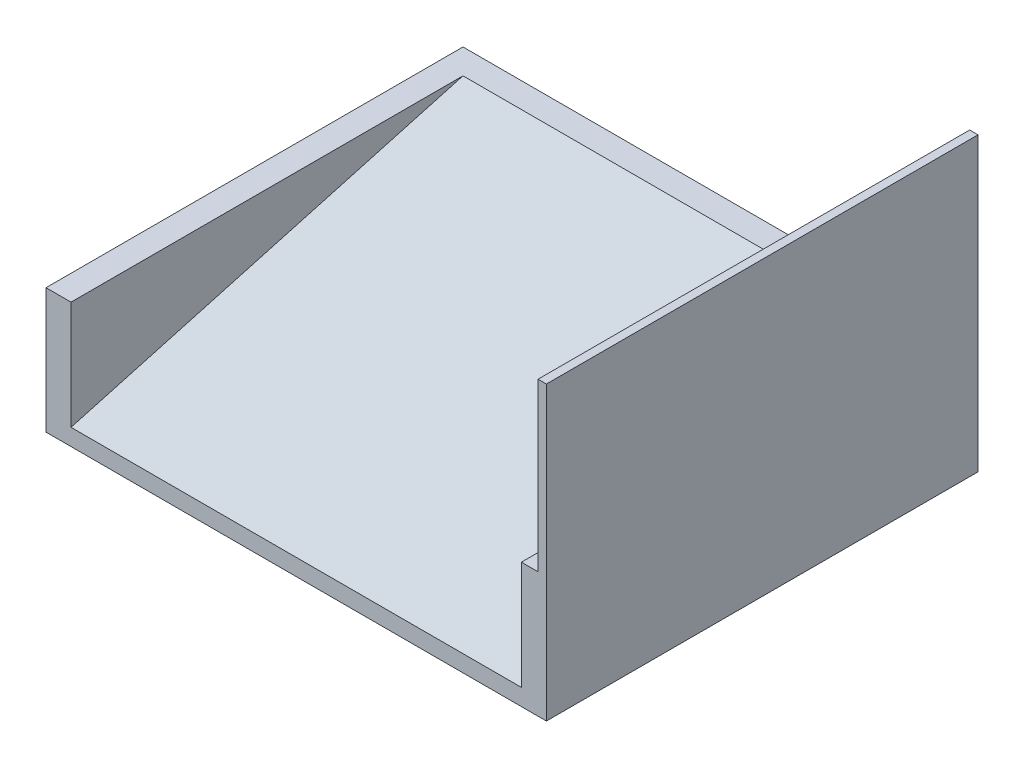
ISO-10303-21;
HEADER;
FILE_DESCRIPTION(('STEP AP214'),'2;1');
FILE_NAME('part.step','',(''),(''),'','','');
FILE_SCHEMA(('AUTOMOTIVE_DESIGN { 1 0 10303 214 1 1 1 1 }'));
ENDSEC;
DATA;
#1=APPLICATION_CONTEXT('core data for automotive mechanical design processes');
#2=APPLICATION_PROTOCOL_DEFINITION('international standard','automotive_design',2000,#1);
#3=PRODUCT_CONTEXT('',#1,'mechanical');
#4=PRODUCT('Part','Part','',(#3));
#5=PRODUCT_RELATED_PRODUCT_CATEGORY('part','',(#4));
#6=PRODUCT_DEFINITION_FORMATION('','',#4);
#7=PRODUCT_DEFINITION_CONTEXT('part definition',#1,'design');
#8=PRODUCT_DEFINITION('design','',#6,#7);
#9=PRODUCT_DEFINITION_SHAPE('','',#8);
#10=(LENGTH_UNIT() NAMED_UNIT(*) SI_UNIT(.MILLI.,.METRE.));
#11=(NAMED_UNIT(*) PLANE_ANGLE_UNIT() SI_UNIT($,.RADIAN.));
#12=(NAMED_UNIT(*) SI_UNIT($,.STERADIAN.) SOLID_ANGLE_UNIT());
#13=UNCERTAINTY_MEASURE_WITH_UNIT(LENGTH_MEASURE(1.E-05),#10,'distance_accuracy_value','');
#14=(GEOMETRIC_REPRESENTATION_CONTEXT(3) GLOBAL_UNCERTAINTY_ASSIGNED_CONTEXT((#13)) GLOBAL_UNIT_ASSIGNED_CONTEXT((#10,
#11,#12)) REPRESENTATION_CONTEXT('',''));
#15=CARTESIAN_POINT('',(0.,0.,0.));
#16=DIRECTION('',(0.,0.,1.));
#17=DIRECTION('',(1.,0.,0.));
#18=AXIS2_PLACEMENT_3D('',#15,#16,#17);
#19=CARTESIAN_POINT('',(3.00000000000001,15.,0.));
#20=DIRECTION('',(-1.,0.,0.));
#21=DIRECTION('',(0.,0.,1.));
#22=AXIS2_PLACEMENT_3D('',#19,#20,#21);
#23=PLANE('',#22);
#24=DIRECTION('',(0.,0.277539652820774,-0.960714182841143));
#25=VECTOR('',#24,1.);
#26=CARTESIAN_POINT('',(3.00000000000001,0.,-2.));
#27=LINE('',#26,#25);
#28=CARTESIAN_POINT('',(3.00000000000001,0.,-2.));
#29=VERTEX_POINT('',#28);
#30=CARTESIAN_POINT('',(3.00000000000001,13.,-47.));
#31=VERTEX_POINT('',#30);
#32=EDGE_CURVE('E146',#29,#31,#27,.T.);
#33=ORIENTED_EDGE('',*,*,#32,.F.);
#34=DIRECTION('',(0.,0.,1.));
#35=VECTOR('',#34,1.);
#36=CARTESIAN_POINT('',(3.00000000000001,0.,-47.));
#37=LINE('',#36,#35);
#38=CARTESIAN_POINT('',(3.00000000000001,0.,-47.));
#39=VERTEX_POINT('',#38);
#40=EDGE_CURVE('E309',#39,#29,#37,.T.);
#41=ORIENTED_EDGE('',*,*,#40,.F.);
#42=DIRECTION('',(0.,-1.,0.));
#43=VECTOR('',#42,1.);
#44=CARTESIAN_POINT('',(3.00000000000001,15.,-47.));
#45=LINE('',#44,#43);
#46=EDGE_CURVE('E164',#31,#39,#45,.T.);
#47=ORIENTED_EDGE('',*,*,#46,.F.);
#48=EDGE_LOOP('',(#33,#41,#47));
#49=FACE_BOUND('',#48,.T.);
#50=ADVANCED_FACE('F36',(#49),#23,.F.);
#51=DIRECTION('',(0.,-0.266586054538395,0.963811120254198));
#52=VECTOR('',#51,1.);
#53=CARTESIAN_POINT('',(3.00000000000001,15.,-47.));
#54=LINE('',#53,#52);
#55=CARTESIAN_POINT('',(3.00000000000001,15.,-47.));
#56=VERTEX_POINT('',#55);
#57=CARTESIAN_POINT('',(3.00000000000001,2.,0.));
#58=VERTEX_POINT('',#57);
#59=EDGE_CURVE('E313',#56,#58,#54,.T.);
#60=ORIENTED_EDGE('',*,*,#59,.F.);
#61=DIRECTION('',(0.,0.,-1.));
#62=VECTOR('',#61,1.);
#63=CARTESIAN_POINT('',(3.00000000000001,15.,0.));
#64=LINE('',#63,#62);
#65=CARTESIAN_POINT('',(3.00000000000001,15.,0.));
#66=VERTEX_POINT('',#65);
#67=EDGE_CURVE('E235',#66,#56,#64,.T.);
#68=ORIENTED_EDGE('',*,*,#67,.F.);
#69=DIRECTION('',(0.,-1.,0.));
#70=VECTOR('',#69,1.);
#71=CARTESIAN_POINT('',(3.00000000000001,15.,0.));
#72=LINE('',#71,#70);
#73=EDGE_CURVE('E167',#66,#58,#72,.T.);
#74=ORIENTED_EDGE('',*,*,#73,.T.);
#75=EDGE_LOOP('',(#60,#68,#74));
#76=FACE_BOUND('',#75,.T.);
#77=ADVANCED_FACE('F327',(#76),#23,.F.);
#78=CARTESIAN_POINT('',(3.00000000000001,15.,-47.));
#79=DIRECTION('',(0.,0.,-1.));
#80=DIRECTION('',(-1.,0.,0.));
#81=AXIS2_PLACEMENT_3D('',#78,#79,#80);
#82=PLANE('',#81);
#83=CARTESIAN_POINT('',(15.,5.6,-47.));
#84=DIRECTION('',(0.,0.,-1.));
#85=DIRECTION('',(-1.,0.,0.));
#86=AXIS2_PLACEMENT_3D('',#83,#84,#85);
#87=CIRCLE('',#86,2.005);
#88=CARTESIAN_POINT('',(12.995,5.6,-47.));
#89=VERTEX_POINT('',#88);
#90=EDGE_CURVE('E282',#89,#89,#87,.F.);
#91=ORIENTED_EDGE('',*,*,#90,.F.);
#92=EDGE_LOOP('',(#91));
#93=FACE_BOUND('',#92,.T.);
#94=CARTESIAN_POINT('',(25.,5.6,-47.));
#95=DIRECTION('',(0.,0.,-1.));
#96=DIRECTION('',(-1.,0.,0.));
#97=AXIS2_PLACEMENT_3D('',#94,#95,#96);
#98=CIRCLE('',#97,2.005);
#99=CARTESIAN_POINT('',(22.995,5.6,-47.));
#100=VERTEX_POINT('',#99);
#101=EDGE_CURVE('E276',#100,#100,#98,.F.);
#102=ORIENTED_EDGE('',*,*,#101,.F.);
#103=EDGE_LOOP('',(#102));
#104=FACE_BOUND('',#103,.T.);
#105=CARTESIAN_POINT('',(35.,5.6,-47.));
#106=DIRECTION('',(0.,0.,-1.));
#107=DIRECTION('',(-1.,0.,0.));
#108=AXIS2_PLACEMENT_3D('',#105,#106,#107);
#109=CIRCLE('',#108,2.005);
#110=CARTESIAN_POINT('',(32.995,5.6,-47.));
#111=VERTEX_POINT('',#110);
#112=EDGE_CURVE('E269',#111,#111,#109,.F.);
#113=ORIENTED_EDGE('',*,*,#112,.F.);
#114=EDGE_LOOP('',(#113));
#115=FACE_BOUND('',#114,.T.);
#116=CARTESIAN_POINT('',(45.,5.6,-47.));
#117=DIRECTION('',(0.,0.,-1.));
#118=DIRECTION('',(-1.,0.,0.));
#119=AXIS2_PLACEMENT_3D('',#116,#117,#118);
#120=CIRCLE('',#119,2.005);
#121=CARTESIAN_POINT('',(42.995,5.6,-47.));
#122=VERTEX_POINT('',#121);
#123=EDGE_CURVE('E268',#122,#122,#120,.F.);
#124=ORIENTED_EDGE('',*,*,#123,.F.);
#125=EDGE_LOOP('',(#124));
#126=FACE_BOUND('',#125,.T.);
#127=DIRECTION('',(-1.,0.,0.));
#128=VECTOR('',#127,1.);
#129=CARTESIAN_POINT('',(60.002,13.,-47.));
#130=LINE('',#129,#128);
#131=CARTESIAN_POINT('',(57.,13.,-47.));
#132=VERTEX_POINT('',#131);
#133=EDGE_CURVE('E140',#132,#31,#130,.T.);
#134=ORIENTED_EDGE('',*,*,#133,.T.);
#135=ORIENTED_EDGE('',*,*,#46,.T.);
#136=DIRECTION('',(1.,0.,0.));
#137=VECTOR('',#136,1.);
#138=CARTESIAN_POINT('',(3.00000000000001,0.,-47.));
#139=LINE('',#138,#137);
#140=CARTESIAN_POINT('',(57.,0.,-47.));
#141=VERTEX_POINT('',#140);
#142=EDGE_CURVE('E163',#39,#141,#139,.T.);
#143=ORIENTED_EDGE('',*,*,#142,.T.);
#144=DIRECTION('',(0.,-1.,0.));
#145=VECTOR('',#144,1.);
#146=CARTESIAN_POINT('',(57.,15.,-47.));
#147=LINE('',#146,#145);
#148=EDGE_CURVE('E155',#132,#141,#147,.T.);
#149=ORIENTED_EDGE('',*,*,#148,.F.);
#150=EDGE_LOOP('',(#134,#135,#143,#149));
#151=FACE_BOUND('',#150,.T.);
#152=ADVANCED_FACE('F161',(#93,#104,#115,#126,#151),#82,.F.);
#153=CARTESIAN_POINT('',(57.,15.,-47.));
#154=DIRECTION('',(1.,0.,0.));
#155=DIRECTION('',(0.,0.,-1.));
#156=AXIS2_PLACEMENT_3D('',#153,#154,#155);
#157=PLANE('',#156);
#158=DIRECTION('',(0.,0.277539652820774,-0.960714182841142));
#159=VECTOR('',#158,1.);
#160=CARTESIAN_POINT('',(57.,0.,-2.));
#161=LINE('',#160,#159);
#162=CARTESIAN_POINT('',(57.,0.,-2.));
#163=VERTEX_POINT('',#162);
#164=EDGE_CURVE('E143',#163,#132,#161,.T.);
#165=ORIENTED_EDGE('',*,*,#164,.T.);
#166=ORIENTED_EDGE('',*,*,#148,.T.);
#167=DIRECTION('',(0.,0.,1.));
#168=VECTOR('',#167,1.);
#169=CARTESIAN_POINT('',(57.,0.,-47.));
#170=LINE('',#169,#168);
#171=EDGE_CURVE('E158',#141,#163,#170,.T.);
#172=ORIENTED_EDGE('',*,*,#171,.T.);
#173=EDGE_LOOP('',(#165,#166,#172));
#174=FACE_BOUND('',#173,.T.);
#175=ADVANCED_FACE('F154',(#174),#157,.F.);
#176=DIRECTION('',(0.,-0.266586054538395,0.963811120254198));
#177=VECTOR('',#176,1.);
#178=CARTESIAN_POINT('',(57.,15.,-47.));
#179=LINE('',#178,#177);
#180=CARTESIAN_POINT('',(57.,15.,-47.));
#181=VERTEX_POINT('',#180);
#182=CARTESIAN_POINT('',(57.,2.,0.));
#183=VERTEX_POINT('',#182);
#184=EDGE_CURVE('E159',#181,#183,#179,.T.);
#185=ORIENTED_EDGE('',*,*,#184,.T.);
#186=DIRECTION('',(0.,-1.,0.));
#187=VECTOR('',#186,1.);
#188=CARTESIAN_POINT('',(57.,15.,0.));
#189=LINE('',#188,#187);
#190=CARTESIAN_POINT('',(57.,15.,0.));
#191=VERTEX_POINT('',#190);
#192=EDGE_CURVE('E165',#191,#183,#189,.T.);
#193=ORIENTED_EDGE('',*,*,#192,.F.);
#194=DIRECTION('',(0.,0.,1.));
#195=VECTOR('',#194,1.);
#196=CARTESIAN_POINT('',(57.,15.,-47.));
#197=LINE('',#196,#195);
#198=EDGE_CURVE('E170',#181,#191,#197,.T.);
#199=ORIENTED_EDGE('',*,*,#198,.F.);
#200=EDGE_LOOP('',(#185,#193,#199));
#201=FACE_BOUND('',#200,.T.);
#202=ADVANCED_FACE('F245',(#201),#157,.F.);
#203=CARTESIAN_POINT('',(0.,2.,-50.));
#204=DIRECTION('',(0.,0.,1.));
#205=DIRECTION('',(1.,0.,0.));
#206=AXIS2_PLACEMENT_3D('',#203,#204,#205);
#207=PLANE('',#206);
#208=CARTESIAN_POINT('',(45.,5.6,-50.));
#209=DIRECTION('',(0.,0.,-1.));
#210=DIRECTION('',(-1.,0.,0.));
#211=AXIS2_PLACEMENT_3D('',#208,#209,#210);
#212=CIRCLE('',#211,2.005);
#213=CARTESIAN_POINT('',(42.995,5.6,-50.));
#214=VERTEX_POINT('',#213);
#215=EDGE_CURVE('E265',#214,#214,#212,.T.);
#216=ORIENTED_EDGE('',*,*,#215,.F.);
#217=EDGE_LOOP('',(#216));
#218=FACE_BOUND('',#217,.T.);
#219=CARTESIAN_POINT('',(35.,5.6,-50.));
#220=DIRECTION('',(0.,0.,-1.));
#221=DIRECTION('',(-1.,0.,0.));
#222=AXIS2_PLACEMENT_3D('',#219,#220,#221);
#223=CIRCLE('',#222,2.005);
#224=CARTESIAN_POINT('',(32.995,5.6,-50.));
#225=VERTEX_POINT('',#224);
#226=EDGE_CURVE('E273',#225,#225,#223,.T.);
#227=ORIENTED_EDGE('',*,*,#226,.F.);
#228=EDGE_LOOP('',(#227));
#229=FACE_BOUND('',#228,.T.);
#230=CARTESIAN_POINT('',(25.,5.6,-50.));
#231=DIRECTION('',(0.,0.,-1.));
#232=DIRECTION('',(-1.,0.,0.));
#233=AXIS2_PLACEMENT_3D('',#230,#231,#232);
#234=CIRCLE('',#233,2.005);
#235=CARTESIAN_POINT('',(22.995,5.6,-50.));
#236=VERTEX_POINT('',#235);
#237=EDGE_CURVE('E279',#236,#236,#234,.T.);
#238=ORIENTED_EDGE('',*,*,#237,.F.);
#239=EDGE_LOOP('',(#238));
#240=FACE_BOUND('',#239,.T.);
#241=CARTESIAN_POINT('',(15.,5.6,-50.));
#242=DIRECTION('',(0.,0.,-1.));
#243=DIRECTION('',(-1.,0.,0.));
#244=AXIS2_PLACEMENT_3D('',#241,#242,#243);
#245=CIRCLE('',#244,2.005);
#246=CARTESIAN_POINT('',(12.995,5.6,-50.));
#247=VERTEX_POINT('',#246);
#248=EDGE_CURVE('E259',#247,#247,#245,.T.);
#249=ORIENTED_EDGE('',*,*,#248,.F.);
#250=EDGE_LOOP('',(#249));
#251=FACE_BOUND('',#250,.T.);
#252=DIRECTION('',(-1.,0.,0.));
#253=VECTOR('',#252,1.);
#254=CARTESIAN_POINT('',(60.,15.,-50.));
#255=LINE('',#254,#253);
#256=CARTESIAN_POINT('',(49.5,15.,-50.));
#257=VERTEX_POINT('',#256);
#258=CARTESIAN_POINT('',(0.,15.,-50.));
#259=VERTEX_POINT('',#258);
#260=EDGE_CURVE('E203',#257,#259,#255,.T.);
#261=ORIENTED_EDGE('',*,*,#260,.F.);
#262=DIRECTION('',(0.,1.,0.));
#263=VECTOR('',#262,1.);
#264=CARTESIAN_POINT('',(49.5,0.,-50.));
#265=LINE('',#264,#263);
#266=CARTESIAN_POINT('',(49.5,0.,-50.));
#267=VERTEX_POINT('',#266);
#268=EDGE_CURVE('E197',#257,#267,#265,.F.);
#269=ORIENTED_EDGE('',*,*,#268,.T.);
#270=DIRECTION('',(-1.,0.,0.));
#271=VECTOR('',#270,1.);
#272=CARTESIAN_POINT('',(0.,0.,-50.));
#273=LINE('',#272,#271);
#274=CARTESIAN_POINT('',(0.,0.,-50.));
#275=VERTEX_POINT('',#274);
#276=EDGE_CURVE('E183',#267,#275,#273,.T.);
#277=ORIENTED_EDGE('',*,*,#276,.T.);
#278=DIRECTION('',(0.,-1.,0.));
#279=VECTOR('',#278,1.);
#280=CARTESIAN_POINT('',(0.,2.,-50.));
#281=LINE('',#280,#279);
#282=EDGE_CURVE('E185',#259,#275,#281,.T.);
#283=ORIENTED_EDGE('',*,*,#282,.F.);
#284=EDGE_LOOP('',(#261,#269,#277,#283));
#285=FACE_BOUND('',#284,.T.);
#286=ADVANCED_FACE('F201',(#218,#229,#240,#251,#285),#207,.F.);
#287=CARTESIAN_POINT('',(0.,2.,0.));
#288=DIRECTION('',(1.,0.,0.));
#289=DIRECTION('',(0.,0.,-1.));
#290=AXIS2_PLACEMENT_3D('',#287,#288,#289);
#291=PLANE('',#290);
#292=DIRECTION('',(0.,0.,1.));
#293=VECTOR('',#292,1.);
#294=CARTESIAN_POINT('',(0.,0.,0.));
#295=LINE('',#294,#293);
#296=CARTESIAN_POINT('',(0.,0.,0.));
#297=VERTEX_POINT('',#296);
#298=EDGE_CURVE('E176',#275,#297,#295,.T.);
#299=ORIENTED_EDGE('',*,*,#298,.T.);
#300=DIRECTION('',(0.,-1.,0.));
#301=VECTOR('',#300,1.);
#302=CARTESIAN_POINT('',(0.,2.,0.));
#303=LINE('',#302,#301);
#304=CARTESIAN_POINT('',(0.,15.,0.));
#305=VERTEX_POINT('',#304);
#306=EDGE_CURVE('E191',#305,#297,#303,.T.);
#307=ORIENTED_EDGE('',*,*,#306,.F.);
#308=DIRECTION('',(0.,0.,1.));
#309=VECTOR('',#308,1.);
#310=CARTESIAN_POINT('',(0.,15.,-50.));
#311=LINE('',#310,#309);
#312=EDGE_CURVE('E230',#259,#305,#311,.T.);
#313=ORIENTED_EDGE('',*,*,#312,.F.);
#314=ORIENTED_EDGE('',*,*,#282,.T.);
#315=EDGE_LOOP('',(#299,#307,#313,#314));
#316=FACE_BOUND('',#315,.T.);
#317=ADVANCED_FACE('F331',(#316),#291,.F.);
#318=CARTESIAN_POINT('',(0.,2.,0.));
#319=DIRECTION('',(0.,0.,-1.));
#320=DIRECTION('',(-1.,0.,0.));
#321=AXIS2_PLACEMENT_3D('',#318,#319,#320);
#322=PLANE('',#321);
#323=ORIENTED_EDGE('',*,*,#192,.T.);
#324=DIRECTION('',(-1.,0.,0.));
#325=VECTOR('',#324,1.);
#326=CARTESIAN_POINT('',(60.002,2.,0.));
#327=LINE('',#326,#325);
#328=EDGE_CURVE('E315',#183,#58,#327,.T.);
#329=ORIENTED_EDGE('',*,*,#328,.T.);
#330=ORIENTED_EDGE('',*,*,#73,.F.);
#331=DIRECTION('',(1.,0.,0.));
#332=VECTOR('',#331,1.);
#333=CARTESIAN_POINT('',(0.,15.,0.));
#334=LINE('',#333,#332);
#335=EDGE_CURVE('E233',#305,#66,#334,.T.);
#336=ORIENTED_EDGE('',*,*,#335,.F.);
#337=ORIENTED_EDGE('',*,*,#306,.T.);
#338=DIRECTION('',(1.,0.,0.));
#339=VECTOR('',#338,1.);
#340=CARTESIAN_POINT('',(0.,0.,0.));
#341=LINE('',#340,#339);
#342=CARTESIAN_POINT('',(60.,0.,0.));
#343=VERTEX_POINT('',#342);
#344=EDGE_CURVE('E179',#297,#343,#341,.T.);
#345=ORIENTED_EDGE('',*,*,#344,.T.);
#346=DIRECTION('',(0.,-1.,0.));
#347=VECTOR('',#346,1.);
#348=CARTESIAN_POINT('',(60.,2.,0.));
#349=LINE('',#348,#347);
#350=CARTESIAN_POINT('',(60.,35.,0.));
#351=VERTEX_POINT('',#350);
#352=EDGE_CURVE('E188',#351,#343,#349,.T.);
#353=ORIENTED_EDGE('',*,*,#352,.F.);
#354=DIRECTION('',(1.,0.,0.));
#355=VECTOR('',#354,1.);
#356=CARTESIAN_POINT('',(60.,35.,0.));
#357=LINE('',#356,#355);
#358=CARTESIAN_POINT('',(59.,35.,0.));
#359=VERTEX_POINT('',#358);
#360=EDGE_CURVE('E253',#359,#351,#357,.T.);
#361=ORIENTED_EDGE('',*,*,#360,.F.);
#362=DIRECTION('',(0.,-1.,0.));
#363=VECTOR('',#362,1.);
#364=CARTESIAN_POINT('',(59.,35.,0.));
#365=LINE('',#364,#363);
#366=CARTESIAN_POINT('',(59.,15.,0.));
#367=VERTEX_POINT('',#366);
#368=EDGE_CURVE('E251',#359,#367,#365,.T.);
#369=ORIENTED_EDGE('',*,*,#368,.T.);
#370=DIRECTION('',(1.,0.,0.));
#371=VECTOR('',#370,1.);
#372=CARTESIAN_POINT('',(57.,15.,0.));
#373=LINE('',#372,#371);
#374=EDGE_CURVE('E222',#191,#367,#373,.T.);
#375=ORIENTED_EDGE('',*,*,#374,.F.);
#376=EDGE_LOOP('',(#323,#329,#330,#336,#337,#345,#353,#361,#369,#375));
#377=FACE_BOUND('',#376,.T.);
#378=ADVANCED_FACE('F248',(#377),#322,.F.);
#379=CARTESIAN_POINT('',(60.,2.,0.));
#380=DIRECTION('',(-1.,0.,0.));
#381=DIRECTION('',(0.,0.,1.));
#382=AXIS2_PLACEMENT_3D('',#379,#380,#381);
#383=PLANE('',#382);
#384=DIRECTION('',(0.,0.,-1.));
#385=VECTOR('',#384,1.);
#386=CARTESIAN_POINT('',(60.,0.,0.));
#387=LINE('',#386,#385);
#388=CARTESIAN_POINT('',(60.,0.,-51.75));
#389=VERTEX_POINT('',#388);
#390=EDGE_CURVE('E181',#343,#389,#387,.T.);
#391=ORIENTED_EDGE('',*,*,#390,.T.);
#392=DIRECTION('',(0.,-1.,0.));
#393=VECTOR('',#392,1.);
#394=CARTESIAN_POINT('',(60.,15.,-51.75));
#395=LINE('',#394,#393);
#396=CARTESIAN_POINT('',(60.,35.,-51.75));
#397=VERTEX_POINT('',#396);
#398=EDGE_CURVE('E272',#397,#389,#395,.T.);
#399=ORIENTED_EDGE('',*,*,#398,.F.);
#400=DIRECTION('',(0.,0.,-1.));
#401=VECTOR('',#400,1.);
#402=CARTESIAN_POINT('',(60.,35.,0.));
#403=LINE('',#402,#401);
#404=EDGE_CURVE('E301',#351,#397,#403,.T.);
#405=ORIENTED_EDGE('',*,*,#404,.F.);
#406=ORIENTED_EDGE('',*,*,#352,.T.);
#407=EDGE_LOOP('',(#391,#399,#405,#406));
#408=FACE_BOUND('',#407,.T.);
#409=ADVANCED_FACE('F298',(#408),#383,.F.);
#410=CARTESIAN_POINT('',(0.,0.,0.));
#411=DIRECTION('',(0.,-1.,0.));
#412=DIRECTION('',(0.,0.,-1.));
#413=AXIS2_PLACEMENT_3D('',#410,#411,#412);
#414=PLANE('',#413);
#415=ORIENTED_EDGE('',*,*,#40,.T.);
#416=DIRECTION('',(-1.,0.,0.));
#417=VECTOR('',#416,1.);
#418=CARTESIAN_POINT('',(60.002,0.,-2.));
#419=LINE('',#418,#417);
#420=EDGE_CURVE('E150',#163,#29,#419,.T.);
#421=ORIENTED_EDGE('',*,*,#420,.F.);
#422=ORIENTED_EDGE('',*,*,#171,.F.);
#423=ORIENTED_EDGE('',*,*,#142,.F.);
#424=EDGE_LOOP('',(#415,#421,#422,#423));
#425=FACE_BOUND('',#424,.T.);
#426=ORIENTED_EDGE('',*,*,#390,.F.);
#427=ORIENTED_EDGE('',*,*,#344,.F.);
#428=ORIENTED_EDGE('',*,*,#298,.F.);
#429=ORIENTED_EDGE('',*,*,#276,.F.);
#430=CARTESIAN_POINT('',(49.5,0.,-51.5));
#431=DIRECTION('',(0.,-1.,0.));
#432=DIRECTION('',(0.,0.,-1.));
#433=AXIS2_PLACEMENT_3D('',#430,#431,#432);
#434=CIRCLE('',#433,1.5);
#435=CARTESIAN_POINT('',(51.,0.,-51.5));
#436=VERTEX_POINT('',#435);
#437=EDGE_CURVE('E11',#267,#436,#434,.F.);
#438=ORIENTED_EDGE('',*,*,#437,.T.);
#439=DIRECTION('',(0.,0.,1.));
#440=VECTOR('',#439,1.);
#441=CARTESIAN_POINT('',(51.,0.,-51.75));
#442=LINE('',#441,#440);
#443=CARTESIAN_POINT('',(51.,0.,-51.75));
#444=VERTEX_POINT('',#443);
#445=EDGE_CURVE('E218',#444,#436,#442,.T.);
#446=ORIENTED_EDGE('',*,*,#445,.F.);
#447=DIRECTION('',(-1.,0.,0.));
#448=VECTOR('',#447,1.);
#449=CARTESIAN_POINT('',(60.,0.,-51.75));
#450=LINE('',#449,#448);
#451=EDGE_CURVE('E291',#389,#444,#450,.T.);
#452=ORIENTED_EDGE('',*,*,#451,.F.);
#453=EDGE_LOOP('',(#426,#427,#428,#429,#438,#446,#452));
#454=FACE_BOUND('',#453,.T.);
#455=ADVANCED_FACE('F209',(#425,#454),#414,.T.);
#456=CARTESIAN_POINT('',(0.,15.,0.));
#457=DIRECTION('',(0.,1.,0.));
#458=DIRECTION('',(0.,0.,1.));
#459=AXIS2_PLACEMENT_3D('',#456,#457,#458);
#460=PLANE('',#459);
#461=DIRECTION('',(0.,0.,1.));
#462=VECTOR('',#461,1.);
#463=CARTESIAN_POINT('',(59.,15.,0.));
#464=LINE('',#463,#462);
#465=CARTESIAN_POINT('',(59.,15.,-51.75));
#466=VERTEX_POINT('',#465);
#467=EDGE_CURVE('E51',#466,#367,#464,.T.);
#468=ORIENTED_EDGE('',*,*,#467,.F.);
#469=DIRECTION('',(1.,0.,0.));
#470=VECTOR('',#469,1.);
#471=CARTESIAN_POINT('',(60.,15.,-51.75));
#472=LINE('',#471,#470);
#473=CARTESIAN_POINT('',(51.,15.,-51.75));
#474=VERTEX_POINT('',#473);
#475=EDGE_CURVE('E220',#474,#466,#472,.T.);
#476=ORIENTED_EDGE('',*,*,#475,.F.);
#477=DIRECTION('',(0.,0.,1.));
#478=VECTOR('',#477,1.);
#479=CARTESIAN_POINT('',(51.,15.,-51.75));
#480=LINE('',#479,#478);
#481=CARTESIAN_POINT('',(51.,15.,-51.5));
#482=VERTEX_POINT('',#481);
#483=EDGE_CURVE('E217',#474,#482,#480,.T.);
#484=ORIENTED_EDGE('',*,*,#483,.T.);
#485=CARTESIAN_POINT('',(49.5,15.,-51.5));
#486=DIRECTION('',(0.,1.,0.));
#487=DIRECTION('',(0.,0.,1.));
#488=AXIS2_PLACEMENT_3D('',#485,#486,#487);
#489=CIRCLE('',#488,1.5);
#490=EDGE_CURVE('E44',#482,#257,#489,.F.);
#491=ORIENTED_EDGE('',*,*,#490,.T.);
#492=ORIENTED_EDGE('',*,*,#260,.T.);
#493=ORIENTED_EDGE('',*,*,#312,.T.);
#494=ORIENTED_EDGE('',*,*,#335,.T.);
#495=ORIENTED_EDGE('',*,*,#67,.T.);
#496=DIRECTION('',(1.,0.,0.));
#497=VECTOR('',#496,1.);
#498=CARTESIAN_POINT('',(3.00000000000001,15.,-47.));
#499=LINE('',#498,#497);
#500=EDGE_CURVE('E238',#56,#181,#499,.T.);
#501=ORIENTED_EDGE('',*,*,#500,.T.);
#502=ORIENTED_EDGE('',*,*,#198,.T.);
#503=ORIENTED_EDGE('',*,*,#374,.T.);
#504=EDGE_LOOP('',(#468,#476,#484,#491,#492,#493,#494,#495,#501,#502,#503));
#505=FACE_BOUND('',#504,.T.);
#506=ADVANCED_FACE('F219',(#505),#460,.T.);
#507=CARTESIAN_POINT('',(51.,15.,-51.75));
#508=DIRECTION('',(1.,0.,0.));
#509=DIRECTION('',(0.,0.,-1.));
#510=AXIS2_PLACEMENT_3D('',#507,#508,#509);
#511=PLANE('',#510);
#512=ORIENTED_EDGE('',*,*,#445,.T.);
#513=DIRECTION('',(0.,1.,0.));
#514=VECTOR('',#513,1.);
#515=CARTESIAN_POINT('',(51.,15.,-51.5));
#516=LINE('',#515,#514);
#517=EDGE_CURVE('E194',#436,#482,#516,.T.);
#518=ORIENTED_EDGE('',*,*,#517,.T.);
#519=ORIENTED_EDGE('',*,*,#483,.F.);
#520=DIRECTION('',(0.,1.,0.));
#521=VECTOR('',#520,1.);
#522=CARTESIAN_POINT('',(51.,15.,-51.75));
#523=LINE('',#522,#521);
#524=EDGE_CURVE('E224',#444,#474,#523,.T.);
#525=ORIENTED_EDGE('',*,*,#524,.F.);
#526=EDGE_LOOP('',(#512,#518,#519,#525));
#527=FACE_BOUND('',#526,.T.);
#528=ADVANCED_FACE('F215',(#527),#511,.F.);
#529=CARTESIAN_POINT('',(0.,0.,-51.75));
#530=DIRECTION('',(0.,0.,-1.));
#531=DIRECTION('',(-1.,0.,0.));
#532=AXIS2_PLACEMENT_3D('',#529,#530,#531);
#533=PLANE('',#532);
#534=ORIENTED_EDGE('',*,*,#398,.T.);
#535=ORIENTED_EDGE('',*,*,#451,.T.);
#536=ORIENTED_EDGE('',*,*,#524,.T.);
#537=ORIENTED_EDGE('',*,*,#475,.T.);
#538=DIRECTION('',(0.,-1.,0.));
#539=VECTOR('',#538,1.);
#540=CARTESIAN_POINT('',(59.,35.,-51.75));
#541=LINE('',#540,#539);
#542=CARTESIAN_POINT('',(59.,35.,-51.75));
#543=VERTEX_POINT('',#542);
#544=EDGE_CURVE('E256',#543,#466,#541,.T.);
#545=ORIENTED_EDGE('',*,*,#544,.F.);
#546=DIRECTION('',(-1.,0.,0.));
#547=VECTOR('',#546,1.);
#548=CARTESIAN_POINT('',(60.,35.,-51.75));
#549=LINE('',#548,#547);
#550=EDGE_CURVE('E304',#397,#543,#549,.T.);
#551=ORIENTED_EDGE('',*,*,#550,.F.);
#552=EDGE_LOOP('',(#534,#535,#536,#537,#545,#551));
#553=FACE_BOUND('',#552,.T.);
#554=ADVANCED_FACE('F293',(#553),#533,.T.);
#555=CARTESIAN_POINT('',(49.5,15.,-51.5));
#556=DIRECTION('',(0.,-1.,0.));
#557=DIRECTION('',(0.,0.,-1.));
#558=AXIS2_PLACEMENT_3D('',#555,#556,#557);
#559=CYLINDRICAL_SURFACE('',#558,1.5);
#560=ORIENTED_EDGE('',*,*,#437,.F.);
#561=ORIENTED_EDGE('',*,*,#268,.F.);
#562=ORIENTED_EDGE('',*,*,#490,.F.);
#563=ORIENTED_EDGE('',*,*,#517,.F.);
#564=EDGE_LOOP('',(#560,#561,#562,#563));
#565=FACE_BOUND('',#564,.T.);
#566=ADVANCED_FACE('F38',(#565),#559,.F.);
#567=CARTESIAN_POINT('',(15.,5.6,0.001000000000001));
#568=DIRECTION('',(0.,0.,-1.));
#569=DIRECTION('',(-1.,0.,0.));
#570=AXIS2_PLACEMENT_3D('',#567,#568,#569);
#571=CYLINDRICAL_SURFACE('',#570,2.005);
#572=ORIENTED_EDGE('',*,*,#248,.T.);
#573=EDGE_LOOP('',(#572));
#574=FACE_BOUND('',#573,.T.);
#575=ORIENTED_EDGE('',*,*,#90,.T.);
#576=EDGE_LOOP('',(#575));
#577=FACE_BOUND('',#576,.T.);
#578=ADVANCED_FACE('F388',(#574,#577),#571,.F.);
#579=CARTESIAN_POINT('',(25.,5.6,0.001000000000001));
#580=DIRECTION('',(0.,0.,-1.));
#581=DIRECTION('',(-1.,0.,0.));
#582=AXIS2_PLACEMENT_3D('',#579,#580,#581);
#583=CYLINDRICAL_SURFACE('',#582,2.005);
#584=ORIENTED_EDGE('',*,*,#237,.T.);
#585=EDGE_LOOP('',(#584));
#586=FACE_BOUND('',#585,.T.);
#587=ORIENTED_EDGE('',*,*,#101,.T.);
#588=EDGE_LOOP('',(#587));
#589=FACE_BOUND('',#588,.T.);
#590=ADVANCED_FACE('F395',(#586,#589),#583,.F.);
#591=CARTESIAN_POINT('',(35.,5.6,0.001000000000001));
#592=DIRECTION('',(0.,0.,-1.));
#593=DIRECTION('',(-1.,0.,0.));
#594=AXIS2_PLACEMENT_3D('',#591,#592,#593);
#595=CYLINDRICAL_SURFACE('',#594,2.005);
#596=ORIENTED_EDGE('',*,*,#226,.T.);
#597=EDGE_LOOP('',(#596));
#598=FACE_BOUND('',#597,.T.);
#599=ORIENTED_EDGE('',*,*,#112,.T.);
#600=EDGE_LOOP('',(#599));
#601=FACE_BOUND('',#600,.T.);
#602=ADVANCED_FACE('F403',(#598,#601),#595,.F.);
#603=CARTESIAN_POINT('',(45.,5.6,0.001000000000001));
#604=DIRECTION('',(0.,0.,-1.));
#605=DIRECTION('',(-1.,0.,0.));
#606=AXIS2_PLACEMENT_3D('',#603,#604,#605);
#607=CYLINDRICAL_SURFACE('',#606,2.005);
#608=ORIENTED_EDGE('',*,*,#215,.T.);
#609=EDGE_LOOP('',(#608));
#610=FACE_BOUND('',#609,.T.);
#611=ORIENTED_EDGE('',*,*,#123,.T.);
#612=EDGE_LOOP('',(#611));
#613=FACE_BOUND('',#612,.T.);
#614=ADVANCED_FACE('F411',(#610,#613),#607,.F.);
#615=CARTESIAN_POINT('',(59.,35.,0.));
#616=DIRECTION('',(1.,0.,0.));
#617=DIRECTION('',(0.,0.,-1.));
#618=AXIS2_PLACEMENT_3D('',#615,#616,#617);
#619=PLANE('',#618);
#620=ORIENTED_EDGE('',*,*,#467,.T.);
#621=ORIENTED_EDGE('',*,*,#368,.F.);
#622=DIRECTION('',(0.,0.,1.));
#623=VECTOR('',#622,1.);
#624=CARTESIAN_POINT('',(59.,35.,0.));
#625=LINE('',#624,#623);
#626=EDGE_CURVE('E261',#543,#359,#625,.T.);
#627=ORIENTED_EDGE('',*,*,#626,.F.);
#628=ORIENTED_EDGE('',*,*,#544,.T.);
#629=EDGE_LOOP('',(#620,#621,#627,#628));
#630=FACE_BOUND('',#629,.T.);
#631=ADVANCED_FACE('F418',(#630),#619,.F.);
#632=CARTESIAN_POINT('',(0.,35.,0.));
#633=DIRECTION('',(0.,1.,0.));
#634=DIRECTION('',(0.,0.,1.));
#635=AXIS2_PLACEMENT_3D('',#632,#633,#634);
#636=PLANE('',#635);
#637=ORIENTED_EDGE('',*,*,#404,.T.);
#638=ORIENTED_EDGE('',*,*,#550,.T.);
#639=ORIENTED_EDGE('',*,*,#626,.T.);
#640=ORIENTED_EDGE('',*,*,#360,.T.);
#641=EDGE_LOOP('',(#637,#638,#639,#640));
#642=FACE_BOUND('',#641,.T.);
#643=ADVANCED_FACE('F303',(#642),#636,.T.);
#644=CARTESIAN_POINT('',(60.002,0.,-2.));
#645=DIRECTION('',(0.,0.960714182841142,0.277539652820774));
#646=DIRECTION('',(0.,-0.277539652820774,0.960714182841143));
#647=AXIS2_PLACEMENT_3D('',#644,#645,#646);
#648=PLANE('',#647);
#649=ORIENTED_EDGE('',*,*,#164,.F.);
#650=ORIENTED_EDGE('',*,*,#420,.T.);
#651=ORIENTED_EDGE('',*,*,#32,.T.);
#652=ORIENTED_EDGE('',*,*,#133,.F.);
#653=EDGE_LOOP('',(#649,#650,#651,#652));
#654=FACE_BOUND('',#653,.T.);
#655=ADVANCED_FACE('F142',(#654),#648,.F.);
#656=CARTESIAN_POINT('',(60.002,15.,-47.));
#657=DIRECTION('',(0.,-0.963811120254198,-0.266586054538395));
#658=DIRECTION('',(0.,0.266586054538395,-0.963811120254198));
#659=AXIS2_PLACEMENT_3D('',#656,#657,#658);
#660=PLANE('',#659);
#661=ORIENTED_EDGE('',*,*,#184,.F.);
#662=ORIENTED_EDGE('',*,*,#500,.F.);
#663=ORIENTED_EDGE('',*,*,#59,.T.);
#664=ORIENTED_EDGE('',*,*,#328,.F.);
#665=EDGE_LOOP('',(#661,#662,#663,#664));
#666=FACE_BOUND('',#665,.T.);
#667=ADVANCED_FACE('F323',(#666),#660,.F.);
#668=CLOSED_SHELL('',(#50,#77,#152,#175,#202,#286,#317,#378,#409,#455,#506,#528,#554,#566,#578,
#590,#602,#614,#631,#643,#655,#667));
#669=MANIFOLD_SOLID_BREP('B2',#668);
#670=ADVANCED_BREP_SHAPE_REPRESENTATION('',(#18,#669),#14);
#671=SHAPE_DEFINITION_REPRESENTATION(#9,#670);
ENDSEC;
END-ISO-10303-21;
